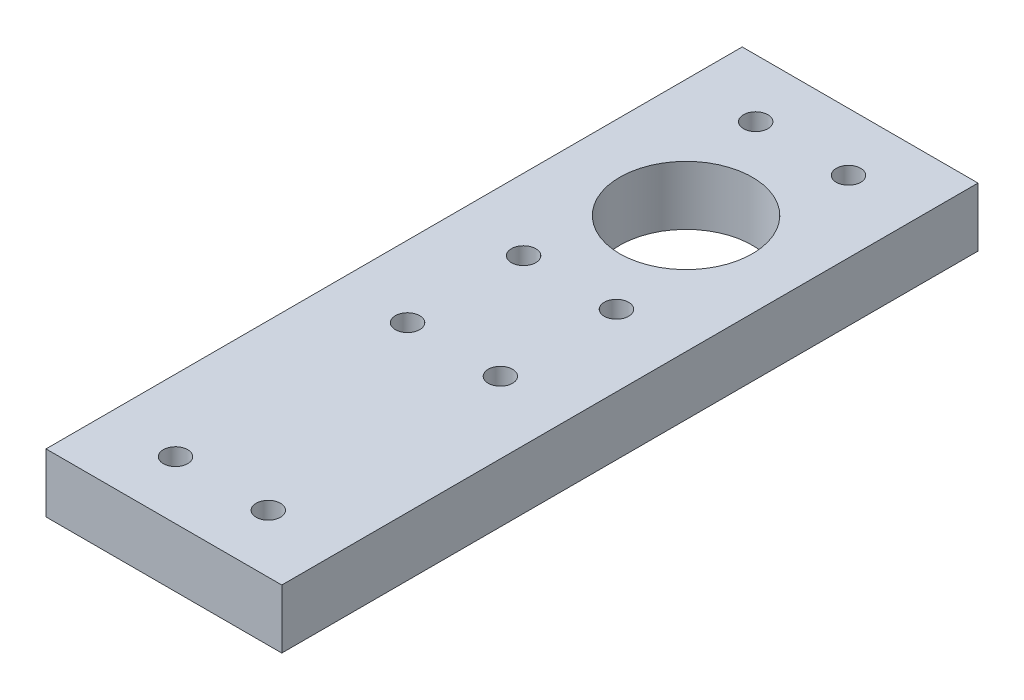
ISO-10303-21;
HEADER;
FILE_DESCRIPTION(('STEP AP214'),'2;1');
FILE_NAME('part.step','',(''),(''),'','','');
FILE_SCHEMA(('AUTOMOTIVE_DESIGN { 1 0 10303 214 1 1 1 1 }'));
ENDSEC;
DATA;
#1=APPLICATION_CONTEXT('core data for automotive mechanical design processes');
#2=APPLICATION_PROTOCOL_DEFINITION('international standard','automotive_design',2000,#1);
#3=PRODUCT_CONTEXT('',#1,'mechanical');
#4=PRODUCT('Part','Part','',(#3));
#5=PRODUCT_RELATED_PRODUCT_CATEGORY('part','',(#4));
#6=PRODUCT_DEFINITION_FORMATION('','',#4);
#7=PRODUCT_DEFINITION_CONTEXT('part definition',#1,'design');
#8=PRODUCT_DEFINITION('design','',#6,#7);
#9=PRODUCT_DEFINITION_SHAPE('','',#8);
#10=(LENGTH_UNIT() NAMED_UNIT(*) SI_UNIT(.MILLI.,.METRE.));
#11=(NAMED_UNIT(*) PLANE_ANGLE_UNIT() SI_UNIT($,.RADIAN.));
#12=(NAMED_UNIT(*) SI_UNIT($,.STERADIAN.) SOLID_ANGLE_UNIT());
#13=UNCERTAINTY_MEASURE_WITH_UNIT(LENGTH_MEASURE(1.E-05),#10,'distance_accuracy_value','');
#14=(GEOMETRIC_REPRESENTATION_CONTEXT(3) GLOBAL_UNCERTAINTY_ASSIGNED_CONTEXT((#13)) GLOBAL_UNIT_ASSIGNED_CONTEXT((#10,
#11,#12)) REPRESENTATION_CONTEXT('',''));
#15=CARTESIAN_POINT('',(0.,0.,0.));
#16=DIRECTION('',(0.,0.,1.));
#17=DIRECTION('',(1.,0.,0.));
#18=AXIS2_PLACEMENT_3D('',#15,#16,#17);
#19=CARTESIAN_POINT('',(0.,25.4,0.));
#20=DIRECTION('',(1.,0.,0.));
#21=DIRECTION('',(0.,0.,-1.));
#22=AXIS2_PLACEMENT_3D('',#19,#20,#21);
#23=PLANE('',#22);
#24=DIRECTION('',(0.,0.,1.));
#25=VECTOR('',#24,1.);
#26=CARTESIAN_POINT('',(0.,0.,0.));
#27=LINE('',#26,#25);
#28=CARTESIAN_POINT('',(0.,0.,-300.));
#29=VERTEX_POINT('',#28);
#30=CARTESIAN_POINT('',(0.,0.,0.));
#31=VERTEX_POINT('',#30);
#32=EDGE_CURVE('E94',#29,#31,#27,.T.);
#33=ORIENTED_EDGE('',*,*,#32,.T.);
#34=DIRECTION('',(0.,-1.,0.));
#35=VECTOR('',#34,1.);
#36=CARTESIAN_POINT('',(0.,25.4,0.));
#37=LINE('',#36,#35);
#38=CARTESIAN_POINT('',(0.,25.4,0.));
#39=VERTEX_POINT('',#38);
#40=EDGE_CURVE('E11',#39,#31,#37,.T.);
#41=ORIENTED_EDGE('',*,*,#40,.F.);
#42=DIRECTION('',(0.,0.,1.));
#43=VECTOR('',#42,1.);
#44=CARTESIAN_POINT('',(0.,25.4,0.));
#45=LINE('',#44,#43);
#46=CARTESIAN_POINT('',(0.,25.4,-300.));
#47=VERTEX_POINT('',#46);
#48=EDGE_CURVE('E82',#47,#39,#45,.T.);
#49=ORIENTED_EDGE('',*,*,#48,.F.);
#50=DIRECTION('',(0.,-1.,0.));
#51=VECTOR('',#50,1.);
#52=CARTESIAN_POINT('',(0.,25.4,-300.));
#53=LINE('',#52,#51);
#54=EDGE_CURVE('E90',#47,#29,#53,.T.);
#55=ORIENTED_EDGE('',*,*,#54,.T.);
#56=EDGE_LOOP('',(#33,#41,#49,#55));
#57=FACE_BOUND('',#56,.T.);
#58=ADVANCED_FACE('F31',(#57),#23,.F.);
#59=CARTESIAN_POINT('',(0.,25.4,0.));
#60=DIRECTION('',(0.,0.,-1.));
#61=DIRECTION('',(-1.,0.,0.));
#62=AXIS2_PLACEMENT_3D('',#59,#60,#61);
#63=PLANE('',#62);
#64=DIRECTION('',(1.,0.,0.));
#65=VECTOR('',#64,1.);
#66=CARTESIAN_POINT('',(0.,0.,0.));
#67=LINE('',#66,#65);
#68=CARTESIAN_POINT('',(101.6,0.,0.));
#69=VERTEX_POINT('',#68);
#70=EDGE_CURVE('E86',#31,#69,#67,.T.);
#71=ORIENTED_EDGE('',*,*,#70,.T.);
#72=DIRECTION('',(0.,-1.,0.));
#73=VECTOR('',#72,1.);
#74=CARTESIAN_POINT('',(101.6,25.4,0.));
#75=LINE('',#74,#73);
#76=CARTESIAN_POINT('',(101.6,25.4,0.));
#77=VERTEX_POINT('',#76);
#78=EDGE_CURVE('E39',#77,#69,#75,.T.);
#79=ORIENTED_EDGE('',*,*,#78,.F.);
#80=DIRECTION('',(1.,0.,0.));
#81=VECTOR('',#80,1.);
#82=CARTESIAN_POINT('',(0.,25.4,0.));
#83=LINE('',#82,#81);
#84=EDGE_CURVE('E77',#39,#77,#83,.T.);
#85=ORIENTED_EDGE('',*,*,#84,.F.);
#86=ORIENTED_EDGE('',*,*,#40,.T.);
#87=EDGE_LOOP('',(#71,#79,#85,#86));
#88=FACE_BOUND('',#87,.T.);
#89=ADVANCED_FACE('F85',(#88),#63,.F.);
#90=CARTESIAN_POINT('',(101.6,25.4,0.));
#91=DIRECTION('',(-1.,0.,0.));
#92=DIRECTION('',(0.,0.,1.));
#93=AXIS2_PLACEMENT_3D('',#90,#91,#92);
#94=PLANE('',#93);
#95=DIRECTION('',(0.,0.,-1.));
#96=VECTOR('',#95,1.);
#97=CARTESIAN_POINT('',(101.6,0.,0.));
#98=LINE('',#97,#96);
#99=CARTESIAN_POINT('',(101.6,0.,-300.));
#100=VERTEX_POINT('',#99);
#101=EDGE_CURVE('E64',#69,#100,#98,.T.);
#102=ORIENTED_EDGE('',*,*,#101,.T.);
#103=DIRECTION('',(0.,-1.,0.));
#104=VECTOR('',#103,1.);
#105=CARTESIAN_POINT('',(101.6,25.4,-300.));
#106=LINE('',#105,#104);
#107=CARTESIAN_POINT('',(101.6,25.4,-300.));
#108=VERTEX_POINT('',#107);
#109=EDGE_CURVE('E87',#108,#100,#106,.T.);
#110=ORIENTED_EDGE('',*,*,#109,.F.);
#111=DIRECTION('',(0.,0.,-1.));
#112=VECTOR('',#111,1.);
#113=CARTESIAN_POINT('',(101.6,25.4,0.));
#114=LINE('',#113,#112);
#115=EDGE_CURVE('E80',#77,#108,#114,.T.);
#116=ORIENTED_EDGE('',*,*,#115,.F.);
#117=ORIENTED_EDGE('',*,*,#78,.T.);
#118=EDGE_LOOP('',(#102,#110,#116,#117));
#119=FACE_BOUND('',#118,.T.);
#120=ADVANCED_FACE('F88',(#119),#94,.F.);
#121=CARTESIAN_POINT('',(0.,25.4,-300.));
#122=DIRECTION('',(0.,0.,1.));
#123=DIRECTION('',(1.,0.,0.));
#124=AXIS2_PLACEMENT_3D('',#121,#122,#123);
#125=PLANE('',#124);
#126=DIRECTION('',(-1.,0.,0.));
#127=VECTOR('',#126,1.);
#128=CARTESIAN_POINT('',(0.,0.,-300.));
#129=LINE('',#128,#127);
#130=EDGE_CURVE('E70',#100,#29,#129,.T.);
#131=ORIENTED_EDGE('',*,*,#130,.T.);
#132=ORIENTED_EDGE('',*,*,#54,.F.);
#133=DIRECTION('',(-1.,0.,0.));
#134=VECTOR('',#133,1.);
#135=CARTESIAN_POINT('',(0.,25.4,-300.));
#136=LINE('',#135,#134);
#137=EDGE_CURVE('E47',#108,#47,#136,.T.);
#138=ORIENTED_EDGE('',*,*,#137,.F.);
#139=ORIENTED_EDGE('',*,*,#109,.T.);
#140=EDGE_LOOP('',(#131,#132,#138,#139));
#141=FACE_BOUND('',#140,.T.);
#142=ADVANCED_FACE('F102',(#141),#125,.F.);
#143=CARTESIAN_POINT('',(0.,25.4,-300.));
#144=DIRECTION('',(0.,-1.,0.));
#145=DIRECTION('',(0.,0.,-1.));
#146=AXIS2_PLACEMENT_3D('',#143,#144,#145);
#147=PLANE('',#146);
#148=CARTESIAN_POINT('',(30.8,25.4,-25.));
#149=DIRECTION('',(0.,1.,0.));
#150=DIRECTION('',(0.,0.,1.));
#151=AXIS2_PLACEMENT_3D('',#148,#149,#150);
#152=CIRCLE('',#151,5.25);
#153=CARTESIAN_POINT('',(30.8,25.4,-19.75));
#154=VERTEX_POINT('',#153);
#155=EDGE_CURVE('E153',#154,#154,#152,.T.);
#156=ORIENTED_EDGE('',*,*,#155,.F.);
#157=EDGE_LOOP('',(#156));
#158=FACE_BOUND('',#157,.T.);
#159=CARTESIAN_POINT('',(70.8,25.4,-25.));
#160=DIRECTION('',(0.,1.,0.));
#161=DIRECTION('',(0.,0.,1.));
#162=AXIS2_PLACEMENT_3D('',#159,#160,#161);
#163=CIRCLE('',#162,5.25);
#164=CARTESIAN_POINT('',(70.8,25.4,-19.75));
#165=VERTEX_POINT('',#164);
#166=EDGE_CURVE('E147',#165,#165,#163,.T.);
#167=ORIENTED_EDGE('',*,*,#166,.F.);
#168=EDGE_LOOP('',(#167));
#169=FACE_BOUND('',#168,.T.);
#170=CARTESIAN_POINT('',(70.8,25.4,-125.));
#171=DIRECTION('',(0.,1.,0.));
#172=DIRECTION('',(0.,0.,1.));
#173=AXIS2_PLACEMENT_3D('',#170,#171,#172);
#174=CIRCLE('',#173,5.25);
#175=CARTESIAN_POINT('',(70.8,25.4,-119.75));
#176=VERTEX_POINT('',#175);
#177=EDGE_CURVE('E141',#176,#176,#174,.T.);
#178=ORIENTED_EDGE('',*,*,#177,.F.);
#179=EDGE_LOOP('',(#178));
#180=FACE_BOUND('',#179,.T.);
#181=CARTESIAN_POINT('',(30.8,25.4,-125.));
#182=DIRECTION('',(0.,1.,0.));
#183=DIRECTION('',(0.,0.,1.));
#184=AXIS2_PLACEMENT_3D('',#181,#182,#183);
#185=CIRCLE('',#184,5.25);
#186=CARTESIAN_POINT('',(30.8,25.4,-119.75));
#187=VERTEX_POINT('',#186);
#188=EDGE_CURVE('E138',#187,#187,#185,.T.);
#189=ORIENTED_EDGE('',*,*,#188,.F.);
#190=EDGE_LOOP('',(#189));
#191=FACE_BOUND('',#190,.T.);
#192=CARTESIAN_POINT('',(30.8,25.4,-175.));
#193=DIRECTION('',(0.,1.,0.));
#194=DIRECTION('',(0.,0.,1.));
#195=AXIS2_PLACEMENT_3D('',#192,#193,#194);
#196=CIRCLE('',#195,5.25);
#197=CARTESIAN_POINT('',(30.8,25.4,-169.75));
#198=VERTEX_POINT('',#197);
#199=EDGE_CURVE('E129',#198,#198,#196,.T.);
#200=ORIENTED_EDGE('',*,*,#199,.F.);
#201=EDGE_LOOP('',(#200));
#202=FACE_BOUND('',#201,.T.);
#203=CARTESIAN_POINT('',(70.8,25.4,-175.));
#204=DIRECTION('',(0.,1.,0.));
#205=DIRECTION('',(0.,0.,1.));
#206=AXIS2_PLACEMENT_3D('',#203,#204,#205);
#207=CIRCLE('',#206,5.25);
#208=CARTESIAN_POINT('',(70.8,25.4,-169.75));
#209=VERTEX_POINT('',#208);
#210=EDGE_CURVE('E123',#209,#209,#207,.T.);
#211=ORIENTED_EDGE('',*,*,#210,.F.);
#212=EDGE_LOOP('',(#211));
#213=FACE_BOUND('',#212,.T.);
#214=CARTESIAN_POINT('',(50.8,25.4,-225.));
#215=DIRECTION('',(0.,1.,0.));
#216=DIRECTION('',(0.,0.,1.));
#217=AXIS2_PLACEMENT_3D('',#214,#215,#216);
#218=CIRCLE('',#217,28.575);
#219=CARTESIAN_POINT('',(50.8,25.4,-196.425));
#220=VERTEX_POINT('',#219);
#221=EDGE_CURVE('E117',#220,#220,#218,.T.);
#222=ORIENTED_EDGE('',*,*,#221,.F.);
#223=EDGE_LOOP('',(#222));
#224=FACE_BOUND('',#223,.T.);
#225=CARTESIAN_POINT('',(70.8,25.4,-275.));
#226=DIRECTION('',(0.,1.,0.));
#227=DIRECTION('',(0.,0.,1.));
#228=AXIS2_PLACEMENT_3D('',#225,#226,#227);
#229=CIRCLE('',#228,5.25);
#230=CARTESIAN_POINT('',(70.8,25.4,-269.75));
#231=VERTEX_POINT('',#230);
#232=EDGE_CURVE('E111',#231,#231,#229,.T.);
#233=ORIENTED_EDGE('',*,*,#232,.F.);
#234=EDGE_LOOP('',(#233));
#235=FACE_BOUND('',#234,.T.);
#236=CARTESIAN_POINT('',(30.8,25.4,-275.));
#237=DIRECTION('',(0.,1.,0.));
#238=DIRECTION('',(0.,0.,1.));
#239=AXIS2_PLACEMENT_3D('',#236,#237,#238);
#240=CIRCLE('',#239,5.25);
#241=CARTESIAN_POINT('',(30.8,25.4,-269.75));
#242=VERTEX_POINT('',#241);
#243=EDGE_CURVE('E108',#242,#242,#240,.T.);
#244=ORIENTED_EDGE('',*,*,#243,.F.);
#245=EDGE_LOOP('',(#244));
#246=FACE_BOUND('',#245,.T.);
#247=ORIENTED_EDGE('',*,*,#48,.T.);
#248=ORIENTED_EDGE('',*,*,#84,.T.);
#249=ORIENTED_EDGE('',*,*,#115,.T.);
#250=ORIENTED_EDGE('',*,*,#137,.T.);
#251=EDGE_LOOP('',(#247,#248,#249,#250));
#252=FACE_BOUND('',#251,.T.);
#253=ADVANCED_FACE('F78',(#158,#169,#180,#191,#202,#213,#224,#235,#246,#252),#147,.F.);
#254=CARTESIAN_POINT('',(0.,0.,-300.));
#255=DIRECTION('',(0.,-1.,0.));
#256=DIRECTION('',(0.,0.,-1.));
#257=AXIS2_PLACEMENT_3D('',#254,#255,#256);
#258=PLANE('',#257);
#259=CARTESIAN_POINT('',(30.8,0.,-25.));
#260=DIRECTION('',(0.,1.,0.));
#261=DIRECTION('',(0.,0.,1.));
#262=AXIS2_PLACEMENT_3D('',#259,#260,#261);
#263=CIRCLE('',#262,5.25);
#264=CARTESIAN_POINT('',(30.8,0.,-19.75));
#265=VERTEX_POINT('',#264);
#266=EDGE_CURVE('E156',#265,#265,#263,.T.);
#267=ORIENTED_EDGE('',*,*,#266,.T.);
#268=EDGE_LOOP('',(#267));
#269=FACE_BOUND('',#268,.T.);
#270=CARTESIAN_POINT('',(70.8,0.,-25.));
#271=DIRECTION('',(0.,1.,0.));
#272=DIRECTION('',(0.,0.,1.));
#273=AXIS2_PLACEMENT_3D('',#270,#271,#272);
#274=CIRCLE('',#273,5.25);
#275=CARTESIAN_POINT('',(70.8,0.,-19.75));
#276=VERTEX_POINT('',#275);
#277=EDGE_CURVE('E150',#276,#276,#274,.T.);
#278=ORIENTED_EDGE('',*,*,#277,.T.);
#279=EDGE_LOOP('',(#278));
#280=FACE_BOUND('',#279,.T.);
#281=CARTESIAN_POINT('',(70.8,0.,-125.));
#282=DIRECTION('',(0.,1.,0.));
#283=DIRECTION('',(0.,0.,1.));
#284=AXIS2_PLACEMENT_3D('',#281,#282,#283);
#285=CIRCLE('',#284,5.25);
#286=CARTESIAN_POINT('',(70.8,0.,-119.75));
#287=VERTEX_POINT('',#286);
#288=EDGE_CURVE('E144',#287,#287,#285,.T.);
#289=ORIENTED_EDGE('',*,*,#288,.T.);
#290=EDGE_LOOP('',(#289));
#291=FACE_BOUND('',#290,.T.);
#292=CARTESIAN_POINT('',(30.8,0.,-125.));
#293=DIRECTION('',(0.,1.,0.));
#294=DIRECTION('',(0.,0.,1.));
#295=AXIS2_PLACEMENT_3D('',#292,#293,#294);
#296=CIRCLE('',#295,5.25);
#297=CARTESIAN_POINT('',(30.8,0.,-119.75));
#298=VERTEX_POINT('',#297);
#299=EDGE_CURVE('E135',#298,#298,#296,.T.);
#300=ORIENTED_EDGE('',*,*,#299,.T.);
#301=EDGE_LOOP('',(#300));
#302=FACE_BOUND('',#301,.T.);
#303=CARTESIAN_POINT('',(30.8,0.,-175.));
#304=DIRECTION('',(0.,1.,0.));
#305=DIRECTION('',(0.,0.,1.));
#306=AXIS2_PLACEMENT_3D('',#303,#304,#305);
#307=CIRCLE('',#306,5.25);
#308=CARTESIAN_POINT('',(30.8,0.,-169.75));
#309=VERTEX_POINT('',#308);
#310=EDGE_CURVE('E132',#309,#309,#307,.T.);
#311=ORIENTED_EDGE('',*,*,#310,.T.);
#312=EDGE_LOOP('',(#311));
#313=FACE_BOUND('',#312,.T.);
#314=CARTESIAN_POINT('',(70.8,0.,-175.));
#315=DIRECTION('',(0.,1.,0.));
#316=DIRECTION('',(0.,0.,1.));
#317=AXIS2_PLACEMENT_3D('',#314,#315,#316);
#318=CIRCLE('',#317,5.25);
#319=CARTESIAN_POINT('',(70.8,0.,-169.75));
#320=VERTEX_POINT('',#319);
#321=EDGE_CURVE('E126',#320,#320,#318,.T.);
#322=ORIENTED_EDGE('',*,*,#321,.T.);
#323=EDGE_LOOP('',(#322));
#324=FACE_BOUND('',#323,.T.);
#325=CARTESIAN_POINT('',(50.8,0.,-225.));
#326=DIRECTION('',(0.,1.,0.));
#327=DIRECTION('',(0.,0.,1.));
#328=AXIS2_PLACEMENT_3D('',#325,#326,#327);
#329=CIRCLE('',#328,28.575);
#330=CARTESIAN_POINT('',(50.8,0.,-196.425));
#331=VERTEX_POINT('',#330);
#332=EDGE_CURVE('E120',#331,#331,#329,.T.);
#333=ORIENTED_EDGE('',*,*,#332,.T.);
#334=EDGE_LOOP('',(#333));
#335=FACE_BOUND('',#334,.T.);
#336=CARTESIAN_POINT('',(70.8,0.,-275.));
#337=DIRECTION('',(0.,1.,0.));
#338=DIRECTION('',(0.,0.,1.));
#339=AXIS2_PLACEMENT_3D('',#336,#337,#338);
#340=CIRCLE('',#339,5.25);
#341=CARTESIAN_POINT('',(70.8,0.,-269.75));
#342=VERTEX_POINT('',#341);
#343=EDGE_CURVE('E114',#342,#342,#340,.T.);
#344=ORIENTED_EDGE('',*,*,#343,.T.);
#345=EDGE_LOOP('',(#344));
#346=FACE_BOUND('',#345,.T.);
#347=CARTESIAN_POINT('',(30.8,0.,-275.));
#348=DIRECTION('',(0.,1.,0.));
#349=DIRECTION('',(0.,0.,1.));
#350=AXIS2_PLACEMENT_3D('',#347,#348,#349);
#351=CIRCLE('',#350,5.25);
#352=CARTESIAN_POINT('',(30.8,0.,-269.75));
#353=VERTEX_POINT('',#352);
#354=EDGE_CURVE('E97',#353,#353,#351,.T.);
#355=ORIENTED_EDGE('',*,*,#354,.T.);
#356=EDGE_LOOP('',(#355));
#357=FACE_BOUND('',#356,.T.);
#358=ORIENTED_EDGE('',*,*,#32,.F.);
#359=ORIENTED_EDGE('',*,*,#130,.F.);
#360=ORIENTED_EDGE('',*,*,#101,.F.);
#361=ORIENTED_EDGE('',*,*,#70,.F.);
#362=EDGE_LOOP('',(#358,#359,#360,#361));
#363=FACE_BOUND('',#362,.T.);
#364=ADVANCED_FACE('F105',(#269,#280,#291,#302,#313,#324,#335,#346,#357,#363),#258,.T.);
#365=CARTESIAN_POINT('',(30.8,0.,-275.));
#366=DIRECTION('',(0.,1.,0.));
#367=DIRECTION('',(0.,0.,1.));
#368=AXIS2_PLACEMENT_3D('',#365,#366,#367);
#369=CYLINDRICAL_SURFACE('',#368,5.25);
#370=ORIENTED_EDGE('',*,*,#354,.F.);
#371=EDGE_LOOP('',(#370));
#372=FACE_BOUND('',#371,.T.);
#373=ORIENTED_EDGE('',*,*,#243,.T.);
#374=EDGE_LOOP('',(#373));
#375=FACE_BOUND('',#374,.T.);
#376=ADVANCED_FACE('F183',(#372,#375),#369,.F.);
#377=CARTESIAN_POINT('',(70.8,0.,-275.));
#378=DIRECTION('',(0.,1.,0.));
#379=DIRECTION('',(0.,0.,1.));
#380=AXIS2_PLACEMENT_3D('',#377,#378,#379);
#381=CYLINDRICAL_SURFACE('',#380,5.25);
#382=ORIENTED_EDGE('',*,*,#343,.F.);
#383=EDGE_LOOP('',(#382));
#384=FACE_BOUND('',#383,.T.);
#385=ORIENTED_EDGE('',*,*,#232,.T.);
#386=EDGE_LOOP('',(#385));
#387=FACE_BOUND('',#386,.T.);
#388=ADVANCED_FACE('F185',(#384,#387),#381,.F.);
#389=CARTESIAN_POINT('',(50.8,0.,-225.));
#390=DIRECTION('',(0.,1.,0.));
#391=DIRECTION('',(0.,0.,1.));
#392=AXIS2_PLACEMENT_3D('',#389,#390,#391);
#393=CYLINDRICAL_SURFACE('',#392,28.575);
#394=ORIENTED_EDGE('',*,*,#332,.F.);
#395=EDGE_LOOP('',(#394));
#396=FACE_BOUND('',#395,.T.);
#397=ORIENTED_EDGE('',*,*,#221,.T.);
#398=EDGE_LOOP('',(#397));
#399=FACE_BOUND('',#398,.T.);
#400=ADVANCED_FACE('F192',(#396,#399),#393,.F.);
#401=CARTESIAN_POINT('',(70.8,0.,-175.));
#402=DIRECTION('',(0.,1.,0.));
#403=DIRECTION('',(0.,0.,1.));
#404=AXIS2_PLACEMENT_3D('',#401,#402,#403);
#405=CYLINDRICAL_SURFACE('',#404,5.25);
#406=ORIENTED_EDGE('',*,*,#321,.F.);
#407=EDGE_LOOP('',(#406));
#408=FACE_BOUND('',#407,.T.);
#409=ORIENTED_EDGE('',*,*,#210,.T.);
#410=EDGE_LOOP('',(#409));
#411=FACE_BOUND('',#410,.T.);
#412=ADVANCED_FACE('F273',(#408,#411),#405,.F.);
#413=CARTESIAN_POINT('',(30.8,0.,-175.));
#414=DIRECTION('',(0.,1.,0.));
#415=DIRECTION('',(0.,0.,1.));
#416=AXIS2_PLACEMENT_3D('',#413,#414,#415);
#417=CYLINDRICAL_SURFACE('',#416,5.25);
#418=ORIENTED_EDGE('',*,*,#310,.F.);
#419=EDGE_LOOP('',(#418));
#420=FACE_BOUND('',#419,.T.);
#421=ORIENTED_EDGE('',*,*,#199,.T.);
#422=EDGE_LOOP('',(#421));
#423=FACE_BOUND('',#422,.T.);
#424=ADVANCED_FACE('F235',(#420,#423),#417,.F.);
#425=CARTESIAN_POINT('',(30.8,0.,-125.));
#426=DIRECTION('',(0.,1.,0.));
#427=DIRECTION('',(0.,0.,1.));
#428=AXIS2_PLACEMENT_3D('',#425,#426,#427);
#429=CYLINDRICAL_SURFACE('',#428,5.25);
#430=ORIENTED_EDGE('',*,*,#299,.F.);
#431=EDGE_LOOP('',(#430));
#432=FACE_BOUND('',#431,.T.);
#433=ORIENTED_EDGE('',*,*,#188,.T.);
#434=EDGE_LOOP('',(#433));
#435=FACE_BOUND('',#434,.T.);
#436=ADVANCED_FACE('F229',(#432,#435),#429,.F.);
#437=CARTESIAN_POINT('',(70.8,0.,-125.));
#438=DIRECTION('',(0.,1.,0.));
#439=DIRECTION('',(0.,0.,1.));
#440=AXIS2_PLACEMENT_3D('',#437,#438,#439);
#441=CYLINDRICAL_SURFACE('',#440,5.25);
#442=ORIENTED_EDGE('',*,*,#288,.F.);
#443=EDGE_LOOP('',(#442));
#444=FACE_BOUND('',#443,.T.);
#445=ORIENTED_EDGE('',*,*,#177,.T.);
#446=EDGE_LOOP('',(#445));
#447=FACE_BOUND('',#446,.T.);
#448=ADVANCED_FACE('F234',(#444,#447),#441,.F.);
#449=CARTESIAN_POINT('',(70.8,0.,-25.));
#450=DIRECTION('',(0.,1.,0.));
#451=DIRECTION('',(0.,0.,1.));
#452=AXIS2_PLACEMENT_3D('',#449,#450,#451);
#453=CYLINDRICAL_SURFACE('',#452,5.25);
#454=ORIENTED_EDGE('',*,*,#277,.F.);
#455=EDGE_LOOP('',(#454));
#456=FACE_BOUND('',#455,.T.);
#457=ORIENTED_EDGE('',*,*,#166,.T.);
#458=EDGE_LOOP('',(#457));
#459=FACE_BOUND('',#458,.T.);
#460=ADVANCED_FACE('F247',(#456,#459),#453,.F.);
#461=CARTESIAN_POINT('',(30.8,0.,-25.));
#462=DIRECTION('',(0.,1.,0.));
#463=DIRECTION('',(0.,0.,1.));
#464=AXIS2_PLACEMENT_3D('',#461,#462,#463);
#465=CYLINDRICAL_SURFACE('',#464,5.25);
#466=ORIENTED_EDGE('',*,*,#266,.F.);
#467=EDGE_LOOP('',(#466));
#468=FACE_BOUND('',#467,.T.);
#469=ORIENTED_EDGE('',*,*,#155,.T.);
#470=EDGE_LOOP('',(#469));
#471=FACE_BOUND('',#470,.T.);
#472=ADVANCED_FACE('F162',(#468,#471),#465,.F.);
#473=CLOSED_SHELL('',(#58,#89,#120,#142,#253,#364,#376,#388,#400,#412,#424,#436,#448,#460,#472));
#474=MANIFOLD_SOLID_BREP('B2',#473);
#475=ADVANCED_BREP_SHAPE_REPRESENTATION('',(#18,#474),#14);
#476=SHAPE_DEFINITION_REPRESENTATION(#9,#475);
ENDSEC;
END-ISO-10303-21;
